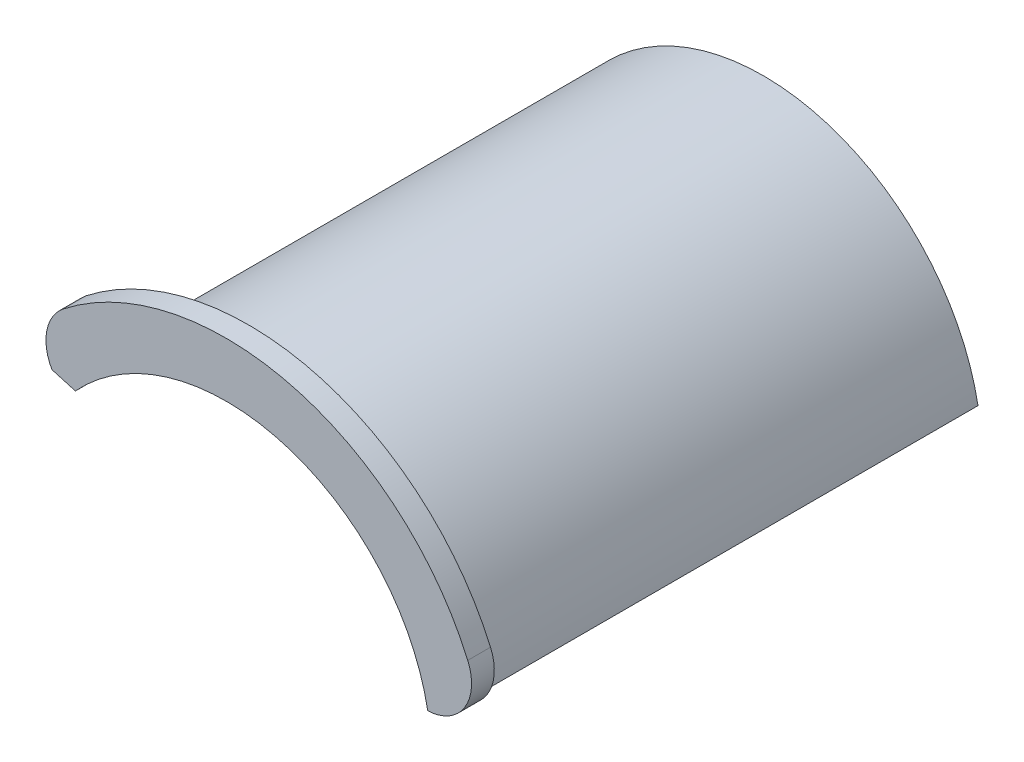
ISO-10303-21;
HEADER;
FILE_DESCRIPTION(('STEP AP214'),'2;1');
FILE_NAME('part.step','',(''),(''),'','','');
FILE_SCHEMA(('AUTOMOTIVE_DESIGN { 1 0 10303 214 1 1 1 1 }'));
ENDSEC;
DATA;
#1=APPLICATION_CONTEXT('core data for automotive mechanical design processes');
#2=APPLICATION_PROTOCOL_DEFINITION('international standard','automotive_design',2000,#1);
#3=PRODUCT_CONTEXT('',#1,'mechanical');
#4=PRODUCT('Part','Part','',(#3));
#5=PRODUCT_RELATED_PRODUCT_CATEGORY('part','',(#4));
#6=PRODUCT_DEFINITION_FORMATION('','',#4);
#7=PRODUCT_DEFINITION_CONTEXT('part definition',#1,'design');
#8=PRODUCT_DEFINITION('design','',#6,#7);
#9=PRODUCT_DEFINITION_SHAPE('','',#8);
#10=(LENGTH_UNIT() NAMED_UNIT(*) SI_UNIT(.MILLI.,.METRE.));
#11=(NAMED_UNIT(*) PLANE_ANGLE_UNIT() SI_UNIT($,.RADIAN.));
#12=(NAMED_UNIT(*) SI_UNIT($,.STERADIAN.) SOLID_ANGLE_UNIT());
#13=UNCERTAINTY_MEASURE_WITH_UNIT(LENGTH_MEASURE(1.E-05),#10,'distance_accuracy_value','');
#14=(GEOMETRIC_REPRESENTATION_CONTEXT(3) GLOBAL_UNCERTAINTY_ASSIGNED_CONTEXT((#13)) GLOBAL_UNIT_ASSIGNED_CONTEXT((#10,
#11,#12)) REPRESENTATION_CONTEXT('',''));
#15=CARTESIAN_POINT('',(0.,0.,0.));
#16=DIRECTION('',(0.,0.,1.));
#17=DIRECTION('',(1.,0.,0.));
#18=AXIS2_PLACEMENT_3D('',#15,#16,#17);
#19=CARTESIAN_POINT('',(0.,0.,118.));
#20=DIRECTION('',(0.,0.,-1.));
#21=DIRECTION('',(-1.,0.,0.));
#22=AXIS2_PLACEMENT_3D('',#19,#20,#21);
#23=CYLINDRICAL_SURFACE('',#22,48.);
#24=CARTESIAN_POINT('',(0.,0.,108.));
#25=DIRECTION('',(0.,0.,1.));
#26=DIRECTION('',(1.,0.,0.));
#27=AXIS2_PLACEMENT_3D('',#24,#25,#26);
#28=CIRCLE('',#27,48.);
#29=CARTESIAN_POINT('',(-36.4063227601084,31.2822579601729,108.));
#30=VERTEX_POINT('',#29);
#31=CARTESIAN_POINT('',(47.1908694294591,8.7762088906168,108.));
#32=VERTEX_POINT('',#31);
#33=EDGE_CURVE('E152',#30,#32,#28,.F.);
#34=ORIENTED_EDGE('',*,*,#33,.T.);
#35=DIRECTION('',(0.,0.,-1.));
#36=VECTOR('',#35,1.);
#37=CARTESIAN_POINT('',(47.1908694294591,8.7762088906168,108.));
#38=LINE('',#37,#36);
#39=CARTESIAN_POINT('',(47.1908694294591,8.77620889061676,0.));
#40=VERTEX_POINT('',#39);
#41=EDGE_CURVE('E45',#32,#40,#38,.T.);
#42=ORIENTED_EDGE('',*,*,#41,.T.);
#43=CARTESIAN_POINT('',(0.,0.,0.));
#44=DIRECTION('',(0.,0.,1.));
#45=DIRECTION('',(1.,0.,0.));
#46=AXIS2_PLACEMENT_3D('',#43,#44,#45);
#47=CIRCLE('',#46,48.);
#48=CARTESIAN_POINT('',(-36.4063227601085,31.282257960173,0.));
#49=VERTEX_POINT('',#48);
#50=EDGE_CURVE('E142',#40,#49,#47,.T.);
#51=ORIENTED_EDGE('',*,*,#50,.T.);
#52=DIRECTION('',(0.,0.,-1.));
#53=VECTOR('',#52,1.);
#54=CARTESIAN_POINT('',(-36.4063227601085,31.282257960173,118.));
#55=LINE('',#54,#53);
#56=EDGE_CURVE('E133',#30,#49,#55,.T.);
#57=ORIENTED_EDGE('',*,*,#56,.F.);
#58=EDGE_LOOP('',(#34,#42,#51,#57));
#59=FACE_BOUND('',#58,.T.);
#60=ADVANCED_FACE('F36',(#59),#23,.T.);
#61=CARTESIAN_POINT('',(0.,0.,118.));
#62=DIRECTION('',(0.,0.,-1.));
#63=DIRECTION('',(-1.,0.,0.));
#64=AXIS2_PLACEMENT_3D('',#61,#62,#63);
#65=CYLINDRICAL_SURFACE('',#64,45.);
#66=DIRECTION('',(0.,0.,-1.));
#67=VECTOR('',#66,1.);
#68=CARTESIAN_POINT('',(-33.2085125293274,30.3676587110285,118.));
#69=LINE('',#68,#67);
#70=CARTESIAN_POINT('',(-33.2085125293274,30.3676587110285,0.));
#71=VERTEX_POINT('',#70);
#72=CARTESIAN_POINT('',(-33.2085125293274,30.3676587110285,118.));
#73=VERTEX_POINT('',#72);
#74=EDGE_CURVE('E123',#71,#73,#69,.F.);
#75=ORIENTED_EDGE('',*,*,#74,.F.);
#76=CARTESIAN_POINT('',(0.,0.,0.));
#77=DIRECTION('',(0.,0.,-1.));
#78=DIRECTION('',(1.,0.,0.));
#79=AXIS2_PLACEMENT_3D('',#76,#77,#78);
#80=CIRCLE('',#79,45.);
#81=CARTESIAN_POINT('',(44.2436660633678,8.21571745334491,0.));
#82=VERTEX_POINT('',#81);
#83=EDGE_CURVE('E147',#71,#82,#80,.T.);
#84=ORIENTED_EDGE('',*,*,#83,.T.);
#85=DIRECTION('',(0.,0.,-1.));
#86=VECTOR('',#85,1.);
#87=CARTESIAN_POINT('',(44.2436660633678,8.21571745334491,118.));
#88=LINE('',#87,#86);
#89=CARTESIAN_POINT('',(44.2436660633678,8.21571745334491,118.));
#90=VERTEX_POINT('',#89);
#91=EDGE_CURVE('E130',#90,#82,#88,.T.);
#92=ORIENTED_EDGE('',*,*,#91,.F.);
#93=CARTESIAN_POINT('',(0.,0.,118.));
#94=DIRECTION('',(0.,0.,-1.));
#95=DIRECTION('',(1.,0.,0.));
#96=AXIS2_PLACEMENT_3D('',#93,#94,#95);
#97=CIRCLE('',#96,45.);
#98=EDGE_CURVE('E144',#73,#90,#97,.T.);
#99=ORIENTED_EDGE('',*,*,#98,.F.);
#100=EDGE_LOOP('',(#75,#84,#92,#99));
#101=FACE_BOUND('',#100,.T.);
#102=ADVANCED_FACE('F184',(#101),#65,.F.);
#103=CARTESIAN_POINT('',(0.,0.,0.));
#104=DIRECTION('',(0.,0.,1.));
#105=DIRECTION('',(1.,0.,0.));
#106=AXIS2_PLACEMENT_3D('',#103,#104,#105);
#107=PLANE('',#106);
#108=ORIENTED_EDGE('',*,*,#50,.F.);
#109=CARTESIAN_POINT('',(43.8701175840497,18.2087380944523,0.));
#110=DIRECTION('',(0.,0.,1.));
#111=DIRECTION('',(1.,0.,0.));
#112=AXIS2_PLACEMENT_3D('',#109,#110,#111);
#113=CIRCLE('',#112,10.);
#114=EDGE_CURVE('E12',#40,#82,#113,.F.);
#115=ORIENTED_EDGE('',*,*,#114,.T.);
#116=ORIENTED_EDGE('',*,*,#83,.F.);
#117=DIRECTION('',(-0.961449322958223,0.274982180119319,0.));
#118=VECTOR('',#117,1.);
#119=CARTESIAN_POINT('',(5.5175767670202,19.2916880821867,0.));
#120=LINE('',#119,#118);
#121=EDGE_CURVE('E124',#71,#49,#120,.T.);
#122=ORIENTED_EDGE('',*,*,#121,.T.);
#123=EDGE_LOOP('',(#108,#115,#116,#122));
#124=FACE_BOUND('',#123,.T.);
#125=ADVANCED_FACE('F181',(#124),#107,.F.);
#126=CARTESIAN_POINT('',(0.,0.,118.));
#127=DIRECTION('',(0.,0.,1.));
#128=DIRECTION('',(1.,0.,0.));
#129=AXIS2_PLACEMENT_3D('',#126,#127,#128);
#130=PLANE('',#129);
#131=ORIENTED_EDGE('',*,*,#98,.T.);
#132=CARTESIAN_POINT('',(43.8701175840497,18.2087380944523,118.));
#133=DIRECTION('',(0.,0.,1.));
#134=DIRECTION('',(1.,0.,0.));
#135=AXIS2_PLACEMENT_3D('',#132,#133,#134);
#136=CIRCLE('',#135,10.);
#137=CARTESIAN_POINT('',(53.0334353097815,22.2129369228435,118.));
#138=VERTEX_POINT('',#137);
#139=EDGE_CURVE('E114',#90,#138,#136,.T.);
#140=ORIENTED_EDGE('',*,*,#139,.T.);
#141=CARTESIAN_POINT('',(-0.113807499462932,-1.01141628182536,118.));
#142=DIRECTION('',(0.,0.,1.));
#143=DIRECTION('',(1.,0.,0.));
#144=AXIS2_PLACEMENT_3D('',#141,#142,#143);
#145=CIRCLE('',#144,58.);
#146=CARTESIAN_POINT('',(-35.8437538586295,44.6763384580508,118.));
#147=VERTEX_POINT('',#146);
#148=EDGE_CURVE('E109',#138,#147,#145,.T.);
#149=ORIENTED_EDGE('',*,*,#148,.T.);
#150=CARTESIAN_POINT('',(-29.6834182794629,36.7991393649687,118.));
#151=DIRECTION('',(0.,0.,1.));
#152=DIRECTION('',(1.,0.,0.));
#153=AXIS2_PLACEMENT_3D('',#150,#151,#152);
#154=CIRCLE('',#153,10.);
#155=CARTESIAN_POINT('',(-38.3692265289265,31.8436641048601,118.));
#156=VERTEX_POINT('',#155);
#157=EDGE_CURVE('E102',#147,#156,#154,.T.);
#158=ORIENTED_EDGE('',*,*,#157,.T.);
#159=DIRECTION('',(-0.961449322958223,0.274982180119319,0.));
#160=VECTOR('',#159,1.);
#161=CARTESIAN_POINT('',(5.5175767670202,19.2916880821867,118.));
#162=LINE('',#161,#160);
#163=EDGE_CURVE('E106',#73,#156,#162,.T.);
#164=ORIENTED_EDGE('',*,*,#163,.F.);
#165=EDGE_LOOP('',(#131,#140,#149,#158,#164));
#166=FACE_BOUND('',#165,.T.);
#167=ADVANCED_FACE('F105',(#166),#130,.T.);
#168=CARTESIAN_POINT('',(-0.113807499462932,-1.01141628182536,113.));
#169=DIRECTION('',(0.,0.,1.));
#170=DIRECTION('',(1.,0.,0.));
#171=AXIS2_PLACEMENT_3D('',#168,#169,#170);
#172=CYLINDRICAL_SURFACE('',#171,58.);
#173=ORIENTED_EDGE('',*,*,#148,.F.);
#174=DIRECTION('',(0.,0.,1.));
#175=VECTOR('',#174,1.);
#176=CARTESIAN_POINT('',(53.0334353097815,22.2129369228435,113.));
#177=LINE('',#176,#175);
#178=CARTESIAN_POINT('',(53.0334353097815,22.2129369228435,113.));
#179=VERTEX_POINT('',#178);
#180=EDGE_CURVE('E203',#138,#179,#177,.F.);
#181=ORIENTED_EDGE('',*,*,#180,.T.);
#182=CARTESIAN_POINT('',(-0.113807499462932,-1.01141628182536,113.));
#183=DIRECTION('',(0.,0.,1.));
#184=DIRECTION('',(1.,0.,0.));
#185=AXIS2_PLACEMENT_3D('',#182,#183,#184);
#186=CIRCLE('',#185,58.);
#187=CARTESIAN_POINT('',(-35.8437538586295,44.6763384580508,113.));
#188=VERTEX_POINT('',#187);
#189=EDGE_CURVE('E140',#179,#188,#186,.T.);
#190=ORIENTED_EDGE('',*,*,#189,.T.);
#191=DIRECTION('',(0.,0.,1.));
#192=VECTOR('',#191,1.);
#193=CARTESIAN_POINT('',(-35.8437538586295,44.6763384580508,113.));
#194=LINE('',#193,#192);
#195=EDGE_CURVE('E115',#188,#147,#194,.T.);
#196=ORIENTED_EDGE('',*,*,#195,.T.);
#197=EDGE_LOOP('',(#173,#181,#190,#196));
#198=FACE_BOUND('',#197,.T.);
#199=ADVANCED_FACE('F174',(#198),#172,.T.);
#200=CARTESIAN_POINT('',(0.,0.,113.));
#201=DIRECTION('',(0.,0.,1.));
#202=DIRECTION('',(1.,0.,0.));
#203=AXIS2_PLACEMENT_3D('',#200,#201,#202);
#204=PLANE('',#203);
#205=ORIENTED_EDGE('',*,*,#189,.F.);
#206=CARTESIAN_POINT('',(43.8701175840497,18.2087380944523,113.));
#207=DIRECTION('',(0.,0.,1.));
#208=DIRECTION('',(1.,0.,0.));
#209=AXIS2_PLACEMENT_3D('',#206,#207,#208);
#210=CIRCLE('',#209,10.);
#211=CARTESIAN_POINT('',(51.6428396150696,11.9170934582305,113.));
#212=VERTEX_POINT('',#211);
#213=EDGE_CURVE('E196',#179,#212,#210,.F.);
#214=ORIENTED_EDGE('',*,*,#213,.T.);
#215=CARTESIAN_POINT('',(0.,0.,113.));
#216=DIRECTION('',(0.,0.,1.));
#217=DIRECTION('',(1.,0.,0.));
#218=AXIS2_PLACEMENT_3D('',#215,#216,#217);
#219=CIRCLE('',#218,53.);
#220=CARTESIAN_POINT('',(-39.5650149955491,35.264849190121,113.));
#221=VERTEX_POINT('',#220);
#222=EDGE_CURVE('E146',#212,#221,#219,.T.);
#223=ORIENTED_EDGE('',*,*,#222,.T.);
#224=CARTESIAN_POINT('',(-29.6834182794629,36.7991393649687,113.));
#225=DIRECTION('',(0.,0.,1.));
#226=DIRECTION('',(1.,0.,0.));
#227=AXIS2_PLACEMENT_3D('',#224,#225,#226);
#228=CIRCLE('',#227,10.);
#229=EDGE_CURVE('E206',#221,#188,#228,.F.);
#230=ORIENTED_EDGE('',*,*,#229,.T.);
#231=EDGE_LOOP('',(#205,#214,#223,#230));
#232=FACE_BOUND('',#231,.T.);
#233=ADVANCED_FACE('F171',(#232),#204,.F.);
#234=CARTESIAN_POINT('',(0.,0.,108.));
#235=DIRECTION('',(0.,0.,1.));
#236=DIRECTION('',(1.,0.,0.));
#237=AXIS2_PLACEMENT_3D('',#234,#235,#236);
#238=TOROIDAL_SURFACE('',#237,53.,5.);
#239=ORIENTED_EDGE('',*,*,#222,.F.);
#240=CARTESIAN_POINT('',(51.6428396150696,11.9170934582305,113.));
#241=CARTESIAN_POINT('',(51.5468753730275,11.798499791473,113.000006434455));
#242=CARTESIAN_POINT('',(51.4481273994657,11.6820927361333,112.995666424888));
#243=CARTESIAN_POINT('',(51.2457288645236,11.4542232657932,112.977494329045));
#244=CARTESIAN_POINT('',(51.1420741226141,11.3427652298813,112.963654007953));
#245=CARTESIAN_POINT('',(50.9302378722994,11.1251025593423,112.925597009465));
#246=CARTESIAN_POINT('',(50.8220386856565,11.0189227972257,112.90133560328));
#247=CARTESIAN_POINT('',(50.6026056147819,10.8130487138541,112.841729759));
#248=CARTESIAN_POINT('',(50.4913725934295,10.7133525752828,112.806388442838));
#249=CARTESIAN_POINT('',(50.266426150319,10.5204798050649,112.723808498982));
#250=CARTESIAN_POINT('',(50.1527019835019,10.4273449952301,112.676501077034));
#251=CARTESIAN_POINT('',(49.9248785480037,10.2487872426527,112.569709867934));
#252=CARTESIAN_POINT('',(49.8107792449881,10.1633650273944,112.510224933874));
#253=CARTESIAN_POINT('',(49.5841700701684,10.0008764594848,112.379134897623));
#254=CARTESIAN_POINT('',(49.47165667311,9.92378763297417,112.307563798749));
#255=CARTESIAN_POINT('',(49.2496244913065,9.77792866206807,112.152337025832));
#256=CARTESIAN_POINT('',(49.1401053166532,9.70915743052163,112.068682934239));
#257=CARTESIAN_POINT('',(48.9374622481408,9.58699457808833,111.899466638771));
#258=CARTESIAN_POINT('',(48.8438515897412,9.53274369705912,111.815103950595));
#259=CARTESIAN_POINT('',(48.6615515896147,9.43075031822264,111.63758533495));
#260=CARTESIAN_POINT('',(48.5728620879741,9.38300760885789,111.544429693474));
#261=CARTESIAN_POINT('',(48.4014514751052,9.29378662416819,111.349861862421));
#262=CARTESIAN_POINT('',(48.3187344308153,9.25231259687023,111.248444144968));
#263=CARTESIAN_POINT('',(48.1603349963444,9.17536715644166,111.038116393228));
#264=CARTESIAN_POINT('',(48.0846525976409,9.1398957360388,110.929206368018));
#265=CARTESIAN_POINT('',(47.9433829763498,9.07559237536629,110.708096123297));
#266=CARTESIAN_POINT('',(47.8775592154989,9.04659171257347,110.596095833213));
#267=CARTESIAN_POINT('',(47.7540220257818,8.99354361435765,110.36652207258));
#268=CARTESIAN_POINT('',(47.6963120445317,8.96949828248909,110.248946261149));
#269=CARTESIAN_POINT('',(47.5896414855022,8.926041333759,110.009125346744));
#270=CARTESIAN_POINT('',(47.5406774667246,8.9066278935193,109.886882103195));
#271=CARTESIAN_POINT('',(47.451947731692,8.87210266023261,109.638513052455));
#272=CARTESIAN_POINT('',(47.4121817455451,8.85699074096594,109.512387359306));
#273=CARTESIAN_POINT('',(47.346428204657,8.83236658760799,109.272453440656));
#274=CARTESIAN_POINT('',(47.319359162633,8.82239967405771,109.158986329129));
#275=CARTESIAN_POINT('',(47.2728220081574,8.8054294724615,108.930292801059));
#276=CARTESIAN_POINT('',(47.2533532529958,8.79842593381676,108.815066534134));
#277=CARTESIAN_POINT('',(47.2221631659316,8.78726896773301,108.583499623792));
#278=CARTESIAN_POINT('',(47.2104375687345,8.78311397113519,108.467159629762));
#279=CARTESIAN_POINT('',(47.1947855285545,8.77758794697508,108.233880045668));
#280=CARTESIAN_POINT('',(47.1908597774364,8.77621716637904,108.116940403337));
#281=CARTESIAN_POINT('',(47.1908694294591,8.7762088906168,108.));
#282=B_SPLINE_CURVE_WITH_KNOTS('',3,(#240,#241,#242,#243,#244,#245,#246,#247,#248,#249,#250,
#251,#252,#253,#254,#255,#256,#257,#258,#259,#260,#261,#262,#263,#264,#265,#266,#267,#268,#269,
#270,#271,#272,#273,#274,#275,#276,#277,#278,#279,#280,#281),.UNSPECIFIED.,.F.,.F.,(4,2,2,2,2,2,
2,2,2,2,2,2,2,2,2,2,2,2,2,2,4),(0.,0.457645142733253,0.915687471365923,1.37571574278575,
1.8356145106153,2.29821988520565,2.76086884918647,3.22223724065321,3.68354526366282,
4.09462484603822,4.50569106249165,4.91703460453056,5.32837764821769,5.72724671356666,
6.12628475295528,6.52516544794975,6.92403443736766,7.27497257034832,7.6258810201929,
7.97659601160633,8.32734211087522),.UNSPECIFIED.);
#283=EDGE_CURVE('E59',#212,#32,#282,.T.);
#284=ORIENTED_EDGE('',*,*,#283,.T.);
#285=ORIENTED_EDGE('',*,*,#33,.F.);
#286=CARTESIAN_POINT('',(-38.3694265289265,31.8437213064563,111.892812643061));
#287=CARTESIAN_POINT('',(-38.2588464491603,31.8120945210546,111.807954765915));
#288=CARTESIAN_POINT('',(-38.1514753780893,31.7813855377522,111.718540488915));
#289=CARTESIAN_POINT('',(-37.9439366984724,31.7220278189235,111.531005829653));
#290=CARTESIAN_POINT('',(-37.8437719752988,31.6933799086368,111.432881994883));
#291=CARTESIAN_POINT('',(-37.6512489871624,31.6383167974185,111.228114078964));
#292=CARTESIAN_POINT('',(-37.5589135989361,31.6119081394161,111.121446688267));
#293=CARTESIAN_POINT('',(-37.3832175314167,31.5616576617974,110.900410462755));
#294=CARTESIAN_POINT('',(-37.2998556569028,31.5378155003383,110.786042656898));
#295=CARTESIAN_POINT('',(-37.1426470527535,31.4928525848,110.549848684042));
#296=CARTESIAN_POINT('',(-37.0688338378694,31.4717414162072,110.427998348516));
#297=CARTESIAN_POINT('',(-36.9318603575463,31.4325659075887,110.177986107309));
#298=CARTESIAN_POINT('',(-36.8686993018178,31.414501341534,110.049824670765));
#299=CARTESIAN_POINT('',(-36.7538824751394,31.3816628127,109.788367553884));
#300=CARTESIAN_POINT('',(-36.7022024697932,31.3668819186899,109.655083398371));
#301=CARTESIAN_POINT('',(-36.6108453818838,31.3407530623864,109.384214504095));
#302=CARTESIAN_POINT('',(-36.5711607902895,31.3294029524501,109.246632515512));
#303=CARTESIAN_POINT('',(-36.5104210476441,31.3120309012627,108.993823535574));
#304=CARTESIAN_POINT('',(-36.4872828034923,31.3054131787587,108.879133070176));
#305=CARTESIAN_POINT('',(-36.4495282194438,31.2946150663848,108.64825593621));
#306=CARTESIAN_POINT('',(-36.434910532552,31.2904342912635,108.532069507105));
#307=CARTESIAN_POINT('',(-36.4142986897685,31.2845391397152,108.298463250254));
#308=CARTESIAN_POINT('',(-36.4083348206088,31.2828334255352,108.181040532499));
#309=CARTESIAN_POINT('',(-36.4051652763626,31.2819269105833,107.946036204375));
#310=CARTESIAN_POINT('',(-36.4079619481638,31.2827267810399,107.828454559863));
#311=CARTESIAN_POINT('',(-36.4151595888373,31.28478536372,107.711161787458));
#312=B_SPLINE_CURVE_WITH_KNOTS('',3,(#286,#287,#288,#289,#290,#291,#292,#293,#294,#295,#296,
#297,#298,#299,#300,#301,#302,#303,#304,#305,#306,#307,#308,#309,#310,#311),.UNSPECIFIED.,.F.,
.F.,(4,2,2,2,2,2,2,2,2,2,2,2,4),(0.,0.428709164450129,0.857589036677236,1.28768172980354,
1.71771706597335,2.14922303438112,2.58069697502224,3.01125131186048,3.44153556433972,
3.79277141363707,4.14395172180002,4.49635815490188,4.84885900329672),.UNSPECIFIED.);
#313=CARTESIAN_POINT('',(-38.3692265289265,31.8436641048601,111.892659135346));
#314=VERTEX_POINT('',#313);
#315=EDGE_CURVE('E154',#314,#30,#312,.T.);
#316=ORIENTED_EDGE('',*,*,#315,.F.);
#317=CARTESIAN_POINT('',(-38.3692265289265,31.8436641048601,111.892659135346));
#318=CARTESIAN_POINT('',(-38.4250653058724,31.9414948205362,111.97770313989));
#319=CARTESIAN_POINT('',(-38.48103406681,32.0434754915783,112.057854697551));
#320=CARTESIAN_POINT('',(-38.5920886403668,32.2549413572705,112.208124747187));
#321=CARTESIAN_POINT('',(-38.647174874209,32.3644228316981,112.278248160362));
#322=CARTESIAN_POINT('',(-38.7550839294622,32.5895777546028,112.407943675068));
#323=CARTESIAN_POINT('',(-38.8079174466697,32.7052142209447,112.467571177208));
#324=CARTESIAN_POINT('',(-38.910664169339,32.9423756479818,112.576780048555));
#325=CARTESIAN_POINT('',(-38.9605772488287,33.0639008622735,112.626360984633));
#326=CARTESIAN_POINT('',(-39.0565580962131,33.3117498678927,112.715606916709));
#327=CARTESIAN_POINT('',(-39.1026317687436,33.4380658392088,112.755287333455));
#328=CARTESIAN_POINT('',(-39.1903335133426,33.6947932171962,112.825197461272));
#329=CARTESIAN_POINT('',(-39.2319611432377,33.8252050295464,112.855426232922));
#330=CARTESIAN_POINT('',(-39.3102377902187,34.0892829046556,112.906916442591));
#331=CARTESIAN_POINT('',(-39.3468852752051,34.2229499540146,112.928175125252));
#332=CARTESIAN_POINT('',(-39.4147837516841,34.4926580371962,112.962273912983));
#333=CARTESIAN_POINT('',(-39.4460364397822,34.628698309792,112.975116668336));
#334=CARTESIAN_POINT('',(-39.4916596111074,34.8483549954819,112.989476310632));
#335=CARTESIAN_POINT('',(-39.5078223170162,34.9314528140641,112.993463131884));
#336=CARTESIAN_POINT('',(-39.5380124504278,35.0979283936732,112.998721752685));
#337=CARTESIAN_POINT('',(-39.5520445991133,35.1813051045812,112.999999639058));
#338=CARTESIAN_POINT('',(-39.5650149955491,35.264849190121,113.));
#339=B_SPLINE_CURVE_WITH_KNOTS('',3,(#317,#318,#319,#320,#321,#322,#323,#324,#325,#326,#327,
#328,#329,#330,#331,#332,#333,#334,#335,#336,#337,#338),.UNSPECIFIED.,.F.,.F.,(4,2,2,2,2,2,2,2,
2,2,4),(0.,0.423256955632267,0.846305484567783,1.26704931538881,1.68781128149304,
2.10791373183262,2.52805792389681,2.94833107855761,3.36847182007675,3.62265440823604,
3.87626525442019),.UNSPECIFIED.);
#340=EDGE_CURVE('E129',#314,#221,#339,.T.);
#341=ORIENTED_EDGE('',*,*,#340,.T.);
#342=EDGE_LOOP('',(#239,#284,#285,#316,#341));
#343=FACE_BOUND('',#342,.T.);
#344=ADVANCED_FACE('F165',(#343),#238,.F.);
#345=CARTESIAN_POINT('',(5.5175767670202,19.2916880821867,118.));
#346=DIRECTION('',(-0.27498218011932,-0.961449322958223,0.));
#347=DIRECTION('',(0.961449322958223,-0.27498218011932,0.));
#348=AXIS2_PLACEMENT_3D('',#345,#346,#347);
#349=PLANE('',#348);
#350=ORIENTED_EDGE('',*,*,#74,.T.);
#351=ORIENTED_EDGE('',*,*,#163,.T.);
#352=DIRECTION('',(0.,0.,-1.));
#353=VECTOR('',#352,1.);
#354=CARTESIAN_POINT('',(-38.3692265289265,31.8436641048601,118.));
#355=LINE('',#354,#353);
#356=EDGE_CURVE('E120',#156,#314,#355,.T.);
#357=ORIENTED_EDGE('',*,*,#356,.T.);
#358=ORIENTED_EDGE('',*,*,#315,.T.);
#359=ORIENTED_EDGE('',*,*,#56,.T.);
#360=ORIENTED_EDGE('',*,*,#121,.F.);
#361=EDGE_LOOP('',(#350,#351,#357,#358,#359,#360));
#362=FACE_BOUND('',#361,.T.);
#363=ADVANCED_FACE('F119',(#362),#349,.T.);
#364=CARTESIAN_POINT('',(-29.6834182794629,36.7991393649687,113.));
#365=DIRECTION('',(0.,0.,1.));
#366=DIRECTION('',(1.,0.,0.));
#367=AXIS2_PLACEMENT_3D('',#364,#365,#366);
#368=CYLINDRICAL_SURFACE('',#367,10.);
#369=ORIENTED_EDGE('',*,*,#157,.F.);
#370=ORIENTED_EDGE('',*,*,#195,.F.);
#371=ORIENTED_EDGE('',*,*,#229,.F.);
#372=ORIENTED_EDGE('',*,*,#340,.F.);
#373=ORIENTED_EDGE('',*,*,#356,.F.);
#374=EDGE_LOOP('',(#369,#370,#371,#372,#373));
#375=FACE_BOUND('',#374,.T.);
#376=ADVANCED_FACE('F126',(#375),#368,.T.);
#377=CARTESIAN_POINT('',(43.8701175840497,18.2087380944523,113.));
#378=DIRECTION('',(0.,0.,-1.));
#379=DIRECTION('',(-1.,0.,0.));
#380=AXIS2_PLACEMENT_3D('',#377,#378,#379);
#381=CYLINDRICAL_SURFACE('',#380,10.);
#382=ORIENTED_EDGE('',*,*,#213,.F.);
#383=ORIENTED_EDGE('',*,*,#180,.F.);
#384=ORIENTED_EDGE('',*,*,#139,.F.);
#385=ORIENTED_EDGE('',*,*,#91,.T.);
#386=ORIENTED_EDGE('',*,*,#114,.F.);
#387=ORIENTED_EDGE('',*,*,#41,.F.);
#388=ORIENTED_EDGE('',*,*,#283,.F.);
#389=EDGE_LOOP('',(#382,#383,#384,#385,#386,#387,#388));
#390=FACE_BOUND('',#389,.T.);
#391=ADVANCED_FACE('F38',(#390),#381,.T.);
#392=CLOSED_SHELL('',(#60,#102,#125,#167,#199,#233,#344,#363,#376,#391));
#393=MANIFOLD_SOLID_BREP('B2',#392);
#394=ADVANCED_BREP_SHAPE_REPRESENTATION('',(#18,#393),#14);
#395=SHAPE_DEFINITION_REPRESENTATION(#9,#394);
ENDSEC;
END-ISO-10303-21;
